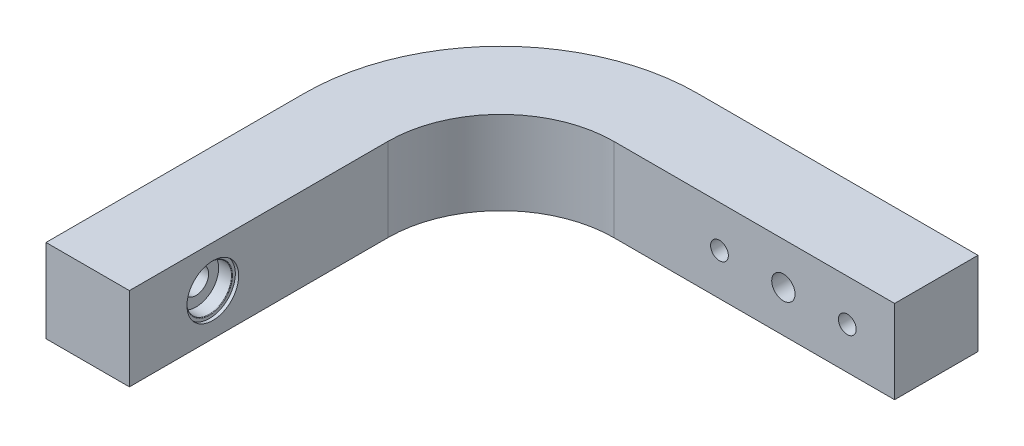
ISO-10303-21;
HEADER;
FILE_DESCRIPTION(('STEP AP214'),'2;1');
FILE_NAME('part.step','',(''),(''),'','','');
FILE_SCHEMA(('AUTOMOTIVE_DESIGN { 1 0 10303 214 1 1 1 1 }'));
ENDSEC;
DATA;
#1=APPLICATION_CONTEXT('core data for automotive mechanical design processes');
#2=APPLICATION_PROTOCOL_DEFINITION('international standard','automotive_design',2000,#1);
#3=PRODUCT_CONTEXT('',#1,'mechanical');
#4=PRODUCT('Part','Part','',(#3));
#5=PRODUCT_RELATED_PRODUCT_CATEGORY('part','',(#4));
#6=PRODUCT_DEFINITION_FORMATION('','',#4);
#7=PRODUCT_DEFINITION_CONTEXT('part definition',#1,'design');
#8=PRODUCT_DEFINITION('design','',#6,#7);
#9=PRODUCT_DEFINITION_SHAPE('','',#8);
#10=(LENGTH_UNIT() NAMED_UNIT(*) SI_UNIT(.MILLI.,.METRE.));
#11=(NAMED_UNIT(*) PLANE_ANGLE_UNIT() SI_UNIT($,.RADIAN.));
#12=(NAMED_UNIT(*) SI_UNIT($,.STERADIAN.) SOLID_ANGLE_UNIT());
#13=UNCERTAINTY_MEASURE_WITH_UNIT(LENGTH_MEASURE(1.E-05),#10,'distance_accuracy_value','');
#14=(GEOMETRIC_REPRESENTATION_CONTEXT(3) GLOBAL_UNCERTAINTY_ASSIGNED_CONTEXT((#13)) GLOBAL_UNIT_ASSIGNED_CONTEXT((#10,
#11,#12)) REPRESENTATION_CONTEXT('',''));
#15=CARTESIAN_POINT('',(0.,0.,0.));
#16=DIRECTION('',(0.,0.,1.));
#17=DIRECTION('',(1.,0.,0.));
#18=AXIS2_PLACEMENT_3D('',#15,#16,#17);
#19=CARTESIAN_POINT('',(-30.482748876,-7.5,35.321832584));
#20=DIRECTION('',(0.,1.,0.));
#21=DIRECTION('',(0.,0.,1.));
#22=AXIS2_PLACEMENT_3D('',#19,#20,#21);
#23=CYLINDRICAL_SURFACE('',#22,35.321832584);
#24=DIRECTION('',(0.,1.,0.));
#25=VECTOR('',#24,1.);
#26=CARTESIAN_POINT('',(-65.80458146,-7.5,35.321832584));
#27=LINE('',#26,#25);
#28=CARTESIAN_POINT('',(-65.80458146,-7.5,35.321832584));
#29=VERTEX_POINT('',#28);
#30=CARTESIAN_POINT('',(-65.80458146,7.5,35.321832584));
#31=VERTEX_POINT('',#30);
#32=EDGE_CURVE('E100',#29,#31,#27,.T.);
#33=ORIENTED_EDGE('',*,*,#32,.T.);
#34=CARTESIAN_POINT('',(-30.482748876,7.5,35.321832584));
#35=DIRECTION('',(0.,1.,0.));
#36=DIRECTION('',(0.,0.,1.));
#37=AXIS2_PLACEMENT_3D('',#34,#35,#36);
#38=CIRCLE('',#37,35.321832584);
#39=CARTESIAN_POINT('',(-30.482748876,7.5,0.));
#40=VERTEX_POINT('',#39);
#41=EDGE_CURVE('E103',#40,#31,#38,.T.);
#42=ORIENTED_EDGE('',*,*,#41,.F.);
#43=DIRECTION('',(0.,1.,0.));
#44=VECTOR('',#43,1.);
#45=CARTESIAN_POINT('',(-30.482748876,-7.5,0.));
#46=LINE('',#45,#44);
#47=CARTESIAN_POINT('',(-30.482748876,-7.5,0.));
#48=VERTEX_POINT('',#47);
#49=EDGE_CURVE('E11',#48,#40,#46,.T.);
#50=ORIENTED_EDGE('',*,*,#49,.F.);
#51=CARTESIAN_POINT('',(-30.482748876,-7.5,35.321832584));
#52=DIRECTION('',(0.,1.,0.));
#53=DIRECTION('',(0.,0.,1.));
#54=AXIS2_PLACEMENT_3D('',#51,#52,#53);
#55=CIRCLE('',#54,35.321832584);
#56=EDGE_CURVE('E104',#48,#29,#55,.T.);
#57=ORIENTED_EDGE('',*,*,#56,.T.);
#58=EDGE_LOOP('',(#33,#42,#50,#57));
#59=FACE_BOUND('',#58,.T.);
#60=ADVANCED_FACE('F38',(#59),#23,.T.);
#61=CARTESIAN_POINT('',(-30.482748876,-7.5,0.));
#62=DIRECTION('',(0.,0.,-1.));
#63=DIRECTION('',(-1.,0.,0.));
#64=AXIS2_PLACEMENT_3D('',#61,#62,#63);
#65=PLANE('',#64);
#66=CARTESIAN_POINT('',(11.5,0.,0.));
#67=DIRECTION('',(0.,0.,-1.));
#68=DIRECTION('',(-1.,0.,0.));
#69=AXIS2_PLACEMENT_3D('',#66,#67,#68);
#70=CIRCLE('',#69,1.6);
#71=CARTESIAN_POINT('',(9.9,0.,0.));
#72=VERTEX_POINT('',#71);
#73=EDGE_CURVE('E183',#72,#72,#70,.T.);
#74=ORIENTED_EDGE('',*,*,#73,.F.);
#75=EDGE_LOOP('',(#74));
#76=FACE_BOUND('',#75,.T.);
#77=CARTESIAN_POINT('',(-11.5,0.,0.));
#78=DIRECTION('',(0.,0.,-1.));
#79=DIRECTION('',(-1.,0.,0.));
#80=AXIS2_PLACEMENT_3D('',#77,#78,#79);
#81=CIRCLE('',#80,1.6);
#82=CARTESIAN_POINT('',(-13.1,0.,0.));
#83=VERTEX_POINT('',#82);
#84=EDGE_CURVE('E210',#83,#83,#81,.T.);
#85=ORIENTED_EDGE('',*,*,#84,.F.);
#86=EDGE_LOOP('',(#85));
#87=FACE_BOUND('',#86,.T.);
#88=CARTESIAN_POINT('',(0.,0.,0.));
#89=DIRECTION('',(0.,0.,-1.));
#90=DIRECTION('',(-1.,0.,0.));
#91=AXIS2_PLACEMENT_3D('',#88,#89,#90);
#92=CIRCLE('',#91,2.1);
#93=CARTESIAN_POINT('',(-2.1,0.,0.));
#94=VERTEX_POINT('',#93);
#95=EDGE_CURVE('E129',#94,#94,#92,.T.);
#96=ORIENTED_EDGE('',*,*,#95,.F.);
#97=EDGE_LOOP('',(#96));
#98=FACE_BOUND('',#97,.T.);
#99=ORIENTED_EDGE('',*,*,#49,.T.);
#100=DIRECTION('',(-1.,0.,0.));
#101=VECTOR('',#100,1.);
#102=CARTESIAN_POINT('',(-30.482748876,7.5,0.));
#103=LINE('',#102,#101);
#104=CARTESIAN_POINT('',(20.,7.5,0.));
#105=VERTEX_POINT('',#104);
#106=EDGE_CURVE('E122',#105,#40,#103,.T.);
#107=ORIENTED_EDGE('',*,*,#106,.F.);
#108=DIRECTION('',(0.,1.,0.));
#109=VECTOR('',#108,1.);
#110=CARTESIAN_POINT('',(20.,-7.5,0.));
#111=LINE('',#110,#109);
#112=CARTESIAN_POINT('',(20.,-7.5,0.));
#113=VERTEX_POINT('',#112);
#114=EDGE_CURVE('E46',#113,#105,#111,.T.);
#115=ORIENTED_EDGE('',*,*,#114,.F.);
#116=DIRECTION('',(-1.,0.,0.));
#117=VECTOR('',#116,1.);
#118=CARTESIAN_POINT('',(-30.482748876,-7.5,0.));
#119=LINE('',#118,#117);
#120=EDGE_CURVE('E109',#113,#48,#119,.T.);
#121=ORIENTED_EDGE('',*,*,#120,.T.);
#122=EDGE_LOOP('',(#99,#107,#115,#121));
#123=FACE_BOUND('',#122,.T.);
#124=ADVANCED_FACE('F217',(#76,#87,#98,#123),#65,.T.);
#125=CARTESIAN_POINT('',(20.,-7.5,15.));
#126=DIRECTION('',(1.,0.,0.));
#127=DIRECTION('',(0.,0.,-1.));
#128=AXIS2_PLACEMENT_3D('',#125,#126,#127);
#129=PLANE('',#128);
#130=ORIENTED_EDGE('',*,*,#114,.T.);
#131=DIRECTION('',(0.,0.,-1.));
#132=VECTOR('',#131,1.);
#133=CARTESIAN_POINT('',(20.,7.5,15.));
#134=LINE('',#133,#132);
#135=CARTESIAN_POINT('',(20.,7.5,15.));
#136=VERTEX_POINT('',#135);
#137=EDGE_CURVE('E142',#136,#105,#134,.T.);
#138=ORIENTED_EDGE('',*,*,#137,.F.);
#139=DIRECTION('',(0.,1.,0.));
#140=VECTOR('',#139,1.);
#141=CARTESIAN_POINT('',(20.,-7.5,15.));
#142=LINE('',#141,#140);
#143=CARTESIAN_POINT('',(20.,-7.5,15.));
#144=VERTEX_POINT('',#143);
#145=EDGE_CURVE('E164',#144,#136,#142,.T.);
#146=ORIENTED_EDGE('',*,*,#145,.F.);
#147=DIRECTION('',(0.,0.,-1.));
#148=VECTOR('',#147,1.);
#149=CARTESIAN_POINT('',(20.,-7.5,15.));
#150=LINE('',#149,#148);
#151=EDGE_CURVE('E160',#144,#113,#150,.T.);
#152=ORIENTED_EDGE('',*,*,#151,.T.);
#153=EDGE_LOOP('',(#130,#138,#146,#152));
#154=FACE_BOUND('',#153,.T.);
#155=ADVANCED_FACE('F220',(#154),#129,.T.);
#156=CARTESIAN_POINT('',(-30.482748876,-7.5,15.));
#157=DIRECTION('',(0.,0.,1.));
#158=DIRECTION('',(1.,0.,0.));
#159=AXIS2_PLACEMENT_3D('',#156,#157,#158);
#160=PLANE('',#159);
#161=CARTESIAN_POINT('',(11.5,0.,15.));
#162=DIRECTION('',(0.,0.,1.));
#163=DIRECTION('',(1.,0.,0.));
#164=AXIS2_PLACEMENT_3D('',#161,#162,#163);
#165=CIRCLE('',#164,1.6);
#166=CARTESIAN_POINT('',(13.1,0.,15.));
#167=VERTEX_POINT('',#166);
#168=EDGE_CURVE('E123',#167,#167,#165,.T.);
#169=ORIENTED_EDGE('',*,*,#168,.F.);
#170=EDGE_LOOP('',(#169));
#171=FACE_BOUND('',#170,.T.);
#172=CARTESIAN_POINT('',(-11.5,0.,15.));
#173=DIRECTION('',(0.,0.,1.));
#174=DIRECTION('',(1.,0.,0.));
#175=AXIS2_PLACEMENT_3D('',#172,#173,#174);
#176=CIRCLE('',#175,1.6);
#177=CARTESIAN_POINT('',(-9.9,0.,15.));
#178=VERTEX_POINT('',#177);
#179=EDGE_CURVE('E126',#178,#178,#176,.T.);
#180=ORIENTED_EDGE('',*,*,#179,.F.);
#181=EDGE_LOOP('',(#180));
#182=FACE_BOUND('',#181,.T.);
#183=CARTESIAN_POINT('',(0.,0.,15.));
#184=DIRECTION('',(0.,0.,1.));
#185=DIRECTION('',(1.,0.,0.));
#186=AXIS2_PLACEMENT_3D('',#183,#184,#185);
#187=CIRCLE('',#186,2.1);
#188=CARTESIAN_POINT('',(2.1,0.,15.));
#189=VERTEX_POINT('',#188);
#190=EDGE_CURVE('E173',#189,#189,#187,.T.);
#191=ORIENTED_EDGE('',*,*,#190,.F.);
#192=EDGE_LOOP('',(#191));
#193=FACE_BOUND('',#192,.T.);
#194=ORIENTED_EDGE('',*,*,#145,.T.);
#195=DIRECTION('',(1.,0.,0.));
#196=VECTOR('',#195,1.);
#197=CARTESIAN_POINT('',(-30.482748876,7.5,15.));
#198=LINE('',#197,#196);
#199=CARTESIAN_POINT('',(-30.482748876,7.5,15.));
#200=VERTEX_POINT('',#199);
#201=EDGE_CURVE('E139',#200,#136,#198,.T.);
#202=ORIENTED_EDGE('',*,*,#201,.F.);
#203=DIRECTION('',(0.,1.,0.));
#204=VECTOR('',#203,1.);
#205=CARTESIAN_POINT('',(-30.482748876,-7.5,15.));
#206=LINE('',#205,#204);
#207=CARTESIAN_POINT('',(-30.482748876,-7.5,15.));
#208=VERTEX_POINT('',#207);
#209=EDGE_CURVE('E166',#208,#200,#206,.T.);
#210=ORIENTED_EDGE('',*,*,#209,.F.);
#211=DIRECTION('',(1.,0.,0.));
#212=VECTOR('',#211,1.);
#213=CARTESIAN_POINT('',(-30.482748876,-7.5,15.));
#214=LINE('',#213,#212);
#215=EDGE_CURVE('E157',#208,#144,#214,.T.);
#216=ORIENTED_EDGE('',*,*,#215,.T.);
#217=EDGE_LOOP('',(#194,#202,#210,#216));
#218=FACE_BOUND('',#217,.T.);
#219=ADVANCED_FACE('F243',(#171,#182,#193,#218),#160,.T.);
#220=CARTESIAN_POINT('',(-30.482748876,-7.5,35.321832584));
#221=DIRECTION('',(0.,1.,0.));
#222=DIRECTION('',(0.,0.,1.));
#223=AXIS2_PLACEMENT_3D('',#220,#221,#222);
#224=CYLINDRICAL_SURFACE('',#223,20.321832584);
#225=ORIENTED_EDGE('',*,*,#209,.T.);
#226=CARTESIAN_POINT('',(-30.482748876,7.5,35.321832584));
#227=DIRECTION('',(0.,-1.,0.));
#228=DIRECTION('',(0.,0.,-1.));
#229=AXIS2_PLACEMENT_3D('',#226,#227,#228);
#230=CIRCLE('',#229,20.321832584);
#231=CARTESIAN_POINT('',(-50.80458146,7.5,35.321832584));
#232=VERTEX_POINT('',#231);
#233=EDGE_CURVE('E136',#232,#200,#230,.T.);
#234=ORIENTED_EDGE('',*,*,#233,.F.);
#235=DIRECTION('',(0.,1.,0.));
#236=VECTOR('',#235,1.);
#237=CARTESIAN_POINT('',(-50.80458146,-7.5,35.321832584));
#238=LINE('',#237,#236);
#239=CARTESIAN_POINT('',(-50.80458146,-7.5,35.321832584));
#240=VERTEX_POINT('',#239);
#241=EDGE_CURVE('E168',#240,#232,#238,.T.);
#242=ORIENTED_EDGE('',*,*,#241,.F.);
#243=CARTESIAN_POINT('',(-30.482748876,-7.5,35.321832584));
#244=DIRECTION('',(0.,-1.,0.));
#245=DIRECTION('',(0.,0.,-1.));
#246=AXIS2_PLACEMENT_3D('',#243,#244,#245);
#247=CIRCLE('',#246,20.321832584);
#248=EDGE_CURVE('E154',#240,#208,#247,.T.);
#249=ORIENTED_EDGE('',*,*,#248,.T.);
#250=EDGE_LOOP('',(#225,#234,#242,#249));
#251=FACE_BOUND('',#250,.T.);
#252=ADVANCED_FACE('F241',(#251),#224,.F.);
#253=CARTESIAN_POINT('',(-50.80458146,-7.5,81.80458146));
#254=DIRECTION('',(1.,0.,0.));
#255=DIRECTION('',(0.,0.,-1.));
#256=AXIS2_PLACEMENT_3D('',#253,#254,#255);
#257=PLANE('',#256);
#258=CARTESIAN_POINT('',(-50.80458146,0.,66.80458146));
#259=DIRECTION('',(-1.,0.,0.));
#260=DIRECTION('',(0.,0.,1.));
#261=AXIS2_PLACEMENT_3D('',#258,#259,#260);
#262=CIRCLE('',#261,4.65000000000002);
#263=CARTESIAN_POINT('',(-50.80458146,0.,71.45458146));
#264=VERTEX_POINT('',#263);
#265=EDGE_CURVE('E206',#264,#264,#262,.T.);
#266=ORIENTED_EDGE('',*,*,#265,.T.);
#267=EDGE_LOOP('',(#266));
#268=FACE_BOUND('',#267,.T.);
#269=ORIENTED_EDGE('',*,*,#241,.T.);
#270=DIRECTION('',(0.,0.,-1.));
#271=VECTOR('',#270,1.);
#272=CARTESIAN_POINT('',(-50.80458146,7.5,81.80458146));
#273=LINE('',#272,#271);
#274=CARTESIAN_POINT('',(-50.80458146,7.5,81.80458146));
#275=VERTEX_POINT('',#274);
#276=EDGE_CURVE('E133',#275,#232,#273,.T.);
#277=ORIENTED_EDGE('',*,*,#276,.F.);
#278=DIRECTION('',(0.,1.,0.));
#279=VECTOR('',#278,1.);
#280=CARTESIAN_POINT('',(-50.80458146,-7.5,81.80458146));
#281=LINE('',#280,#279);
#282=CARTESIAN_POINT('',(-50.80458146,-7.5,81.80458146));
#283=VERTEX_POINT('',#282);
#284=EDGE_CURVE('E170',#283,#275,#281,.T.);
#285=ORIENTED_EDGE('',*,*,#284,.F.);
#286=DIRECTION('',(0.,0.,-1.));
#287=VECTOR('',#286,1.);
#288=CARTESIAN_POINT('',(-50.80458146,-7.5,81.80458146));
#289=LINE('',#288,#287);
#290=EDGE_CURVE('E151',#283,#240,#289,.T.);
#291=ORIENTED_EDGE('',*,*,#290,.T.);
#292=EDGE_LOOP('',(#269,#277,#285,#291));
#293=FACE_BOUND('',#292,.T.);
#294=ADVANCED_FACE('F239',(#268,#293),#257,.T.);
#295=CARTESIAN_POINT('',(-65.80458146,-7.5,81.80458146));
#296=DIRECTION('',(0.,0.,1.));
#297=DIRECTION('',(1.,0.,0.));
#298=AXIS2_PLACEMENT_3D('',#295,#296,#297);
#299=PLANE('',#298);
#300=ORIENTED_EDGE('',*,*,#284,.T.);
#301=DIRECTION('',(1.,0.,0.));
#302=VECTOR('',#301,1.);
#303=CARTESIAN_POINT('',(-65.80458146,7.5,81.80458146));
#304=LINE('',#303,#302);
#305=CARTESIAN_POINT('',(-65.80458146,7.5,81.80458146));
#306=VERTEX_POINT('',#305);
#307=EDGE_CURVE('E117',#306,#275,#304,.T.);
#308=ORIENTED_EDGE('',*,*,#307,.F.);
#309=DIRECTION('',(0.,1.,0.));
#310=VECTOR('',#309,1.);
#311=CARTESIAN_POINT('',(-65.80458146,-7.5,81.80458146));
#312=LINE('',#311,#310);
#313=CARTESIAN_POINT('',(-65.80458146,-7.5,81.80458146));
#314=VERTEX_POINT('',#313);
#315=EDGE_CURVE('E108',#314,#306,#312,.T.);
#316=ORIENTED_EDGE('',*,*,#315,.F.);
#317=DIRECTION('',(1.,0.,0.));
#318=VECTOR('',#317,1.);
#319=CARTESIAN_POINT('',(-65.80458146,-7.5,81.80458146));
#320=LINE('',#319,#318);
#321=EDGE_CURVE('E148',#314,#283,#320,.T.);
#322=ORIENTED_EDGE('',*,*,#321,.T.);
#323=EDGE_LOOP('',(#300,#308,#316,#322));
#324=FACE_BOUND('',#323,.T.);
#325=ADVANCED_FACE('F235',(#324),#299,.T.);
#326=CARTESIAN_POINT('',(-65.80458146,-7.5,35.321832584));
#327=DIRECTION('',(-1.,0.,0.));
#328=DIRECTION('',(0.,0.,1.));
#329=AXIS2_PLACEMENT_3D('',#326,#327,#328);
#330=PLANE('',#329);
#331=CARTESIAN_POINT('',(-65.80458146,0.,66.80458146));
#332=DIRECTION('',(-1.,0.,0.));
#333=DIRECTION('',(0.,0.,1.));
#334=AXIS2_PLACEMENT_3D('',#331,#332,#333);
#335=CIRCLE('',#334,4.65000000000002);
#336=CARTESIAN_POINT('',(-65.80458146,0.,71.45458146));
#337=VERTEX_POINT('',#336);
#338=EDGE_CURVE('E179',#337,#337,#335,.T.);
#339=ORIENTED_EDGE('',*,*,#338,.F.);
#340=EDGE_LOOP('',(#339));
#341=FACE_BOUND('',#340,.T.);
#342=ORIENTED_EDGE('',*,*,#315,.T.);
#343=DIRECTION('',(0.,0.,1.));
#344=VECTOR('',#343,1.);
#345=CARTESIAN_POINT('',(-65.80458146,7.5,35.321832584));
#346=LINE('',#345,#344);
#347=EDGE_CURVE('E112',#31,#306,#346,.T.);
#348=ORIENTED_EDGE('',*,*,#347,.F.);
#349=ORIENTED_EDGE('',*,*,#32,.F.);
#350=DIRECTION('',(0.,0.,1.));
#351=VECTOR('',#350,1.);
#352=CARTESIAN_POINT('',(-65.80458146,-7.5,35.321832584));
#353=LINE('',#352,#351);
#354=EDGE_CURVE('E146',#29,#314,#353,.T.);
#355=ORIENTED_EDGE('',*,*,#354,.T.);
#356=EDGE_LOOP('',(#342,#348,#349,#355));
#357=FACE_BOUND('',#356,.T.);
#358=ADVANCED_FACE('F113',(#341,#357),#330,.T.);
#359=CARTESIAN_POINT('',(-30.482748876,-7.5,35.321832584));
#360=DIRECTION('',(0.,1.,0.));
#361=DIRECTION('',(0.,0.,1.));
#362=AXIS2_PLACEMENT_3D('',#359,#360,#361);
#363=PLANE('',#362);
#364=ORIENTED_EDGE('',*,*,#56,.F.);
#365=ORIENTED_EDGE('',*,*,#120,.F.);
#366=ORIENTED_EDGE('',*,*,#151,.F.);
#367=ORIENTED_EDGE('',*,*,#215,.F.);
#368=ORIENTED_EDGE('',*,*,#248,.F.);
#369=ORIENTED_EDGE('',*,*,#290,.F.);
#370=ORIENTED_EDGE('',*,*,#321,.F.);
#371=ORIENTED_EDGE('',*,*,#354,.F.);
#372=EDGE_LOOP('',(#364,#365,#366,#367,#368,#369,#370,#371));
#373=FACE_BOUND('',#372,.T.);
#374=ADVANCED_FACE('F229',(#373),#363,.F.);
#375=CARTESIAN_POINT('',(-30.482748876,7.5,35.321832584));
#376=DIRECTION('',(0.,1.,0.));
#377=DIRECTION('',(0.,0.,1.));
#378=AXIS2_PLACEMENT_3D('',#375,#376,#377);
#379=PLANE('',#378);
#380=ORIENTED_EDGE('',*,*,#41,.T.);
#381=ORIENTED_EDGE('',*,*,#347,.T.);
#382=ORIENTED_EDGE('',*,*,#307,.T.);
#383=ORIENTED_EDGE('',*,*,#276,.T.);
#384=ORIENTED_EDGE('',*,*,#233,.T.);
#385=ORIENTED_EDGE('',*,*,#201,.T.);
#386=ORIENTED_EDGE('',*,*,#137,.T.);
#387=ORIENTED_EDGE('',*,*,#106,.T.);
#388=EDGE_LOOP('',(#380,#381,#382,#383,#384,#385,#386,#387));
#389=FACE_BOUND('',#388,.T.);
#390=ADVANCED_FACE('F120',(#389),#379,.T.);
#391=CARTESIAN_POINT('',(0.,0.,81.80458146));
#392=DIRECTION('',(0.,0.,-1.));
#393=DIRECTION('',(-1.,0.,0.));
#394=AXIS2_PLACEMENT_3D('',#391,#392,#393);
#395=CYLINDRICAL_SURFACE('',#394,2.1);
#396=ORIENTED_EDGE('',*,*,#190,.T.);
#397=EDGE_LOOP('',(#396));
#398=FACE_BOUND('',#397,.T.);
#399=ORIENTED_EDGE('',*,*,#95,.T.);
#400=EDGE_LOOP('',(#399));
#401=FACE_BOUND('',#400,.T.);
#402=ADVANCED_FACE('F327',(#398,#401),#395,.F.);
#403=CARTESIAN_POINT('',(-11.5,0.,81.80458146));
#404=DIRECTION('',(0.,0.,-1.));
#405=DIRECTION('',(-1.,0.,0.));
#406=AXIS2_PLACEMENT_3D('',#403,#404,#405);
#407=CYLINDRICAL_SURFACE('',#406,1.6);
#408=ORIENTED_EDGE('',*,*,#179,.T.);
#409=EDGE_LOOP('',(#408));
#410=FACE_BOUND('',#409,.T.);
#411=ORIENTED_EDGE('',*,*,#84,.T.);
#412=EDGE_LOOP('',(#411));
#413=FACE_BOUND('',#412,.T.);
#414=ADVANCED_FACE('F347',(#410,#413),#407,.F.);
#415=CARTESIAN_POINT('',(11.5,0.,81.80458146));
#416=DIRECTION('',(0.,0.,-1.));
#417=DIRECTION('',(-1.,0.,0.));
#418=AXIS2_PLACEMENT_3D('',#415,#416,#417);
#419=CYLINDRICAL_SURFACE('',#418,1.6);
#420=ORIENTED_EDGE('',*,*,#168,.T.);
#421=EDGE_LOOP('',(#420));
#422=FACE_BOUND('',#421,.T.);
#423=ORIENTED_EDGE('',*,*,#73,.T.);
#424=EDGE_LOOP('',(#423));
#425=FACE_BOUND('',#424,.T.);
#426=ADVANCED_FACE('F215',(#422,#425),#419,.F.);
#427=CARTESIAN_POINT('',(-53.80458146,0.,70.85458146));
#428=DIRECTION('',(-1.,0.,0.));
#429=DIRECTION('',(0.,0.,1.));
#430=AXIS2_PLACEMENT_3D('',#427,#428,#429);
#431=PLANE('',#430);
#432=CARTESIAN_POINT('',(-53.80458146,0.,66.80458146));
#433=DIRECTION('',(-1.,0.,0.));
#434=DIRECTION('',(0.,0.,1.));
#435=AXIS2_PLACEMENT_3D('',#432,#433,#434);
#436=CIRCLE('',#435,4.05);
#437=CARTESIAN_POINT('',(-53.80458146,0.,70.85458146));
#438=VERTEX_POINT('',#437);
#439=EDGE_CURVE('E194',#438,#438,#436,.T.);
#440=ORIENTED_EDGE('',*,*,#439,.F.);
#441=EDGE_LOOP('',(#440));
#442=FACE_BOUND('',#441,.T.);
#443=CARTESIAN_POINT('',(-53.80458146,0.,66.80458146));
#444=DIRECTION('',(-1.,0.,0.));
#445=DIRECTION('',(0.,0.,1.));
#446=AXIS2_PLACEMENT_3D('',#443,#444,#445);
#447=CIRCLE('',#446,2.25);
#448=CARTESIAN_POINT('',(-53.80458146,0.,69.05458146));
#449=VERTEX_POINT('',#448);
#450=EDGE_CURVE('E177',#449,#449,#447,.F.);
#451=ORIENTED_EDGE('',*,*,#450,.F.);
#452=EDGE_LOOP('',(#451));
#453=FACE_BOUND('',#452,.T.);
#454=ADVANCED_FACE('F365',(#442,#453),#431,.F.);
#455=CARTESIAN_POINT('',(-84.3923413330759,0.,66.80458146));
#456=DIRECTION('',(-1.,0.,0.));
#457=DIRECTION('',(0.,0.,1.));
#458=AXIS2_PLACEMENT_3D('',#455,#456,#457);
#459=CYLINDRICAL_SURFACE('',#458,4.65000000000002);
#460=ORIENTED_EDGE('',*,*,#265,.F.);
#461=EDGE_LOOP('',(#460));
#462=FACE_BOUND('',#461,.T.);
#463=CARTESIAN_POINT('',(-51.40458146,0.,66.80458146));
#464=DIRECTION('',(-1.,0.,0.));
#465=DIRECTION('',(0.,0.,1.));
#466=AXIS2_PLACEMENT_3D('',#463,#464,#465);
#467=CIRCLE('',#466,4.65000000000002);
#468=CARTESIAN_POINT('',(-51.40458146,0.,71.45458146));
#469=VERTEX_POINT('',#468);
#470=EDGE_CURVE('E203',#469,#469,#467,.T.);
#471=ORIENTED_EDGE('',*,*,#470,.T.);
#472=EDGE_LOOP('',(#471));
#473=FACE_BOUND('',#472,.T.);
#474=ADVANCED_FACE('F374',(#462,#473),#459,.F.);
#475=CARTESIAN_POINT('',(-51.40458146,0.,71.45458146));
#476=DIRECTION('',(-1.,0.,0.));
#477=DIRECTION('',(0.,0.,1.));
#478=AXIS2_PLACEMENT_3D('',#475,#476,#477);
#479=PLANE('',#478);
#480=ORIENTED_EDGE('',*,*,#470,.F.);
#481=EDGE_LOOP('',(#480));
#482=FACE_BOUND('',#481,.T.);
#483=CARTESIAN_POINT('',(-51.40458146,0.,66.80458146));
#484=DIRECTION('',(-1.,0.,0.));
#485=DIRECTION('',(0.,0.,1.));
#486=AXIS2_PLACEMENT_3D('',#483,#484,#485);
#487=CIRCLE('',#486,4.15);
#488=CARTESIAN_POINT('',(-51.40458146,0.,70.95458146));
#489=VERTEX_POINT('',#488);
#490=EDGE_CURVE('E200',#489,#489,#487,.T.);
#491=ORIENTED_EDGE('',*,*,#490,.T.);
#492=EDGE_LOOP('',(#491));
#493=FACE_BOUND('',#492,.T.);
#494=ADVANCED_FACE('F384',(#482,#493),#479,.F.);
#495=CARTESIAN_POINT('',(-51.50458146,0.,66.80458146));
#496=DIRECTION('',(-1.,0.,0.));
#497=DIRECTION('',(0.,0.,1.));
#498=AXIS2_PLACEMENT_3D('',#495,#496,#497);
#499=TOROIDAL_SURFACE('',#498,4.15,0.100000000000003);
#500=ORIENTED_EDGE('',*,*,#490,.F.);
#501=EDGE_LOOP('',(#500));
#502=FACE_BOUND('',#501,.T.);
#503=CARTESIAN_POINT('',(-51.50458146,0.,66.80458146));
#504=DIRECTION('',(-1.,0.,0.));
#505=DIRECTION('',(0.,0.,1.));
#506=AXIS2_PLACEMENT_3D('',#503,#504,#505);
#507=CIRCLE('',#506,4.05);
#508=CARTESIAN_POINT('',(-51.50458146,0.,70.85458146));
#509=VERTEX_POINT('',#508);
#510=EDGE_CURVE('E197',#509,#509,#507,.T.);
#511=ORIENTED_EDGE('',*,*,#510,.T.);
#512=EDGE_LOOP('',(#511));
#513=FACE_BOUND('',#512,.T.);
#514=ADVANCED_FACE('F394',(#502,#513),#499,.T.);
#515=CARTESIAN_POINT('',(-84.3923413330759,0.,66.80458146));
#516=DIRECTION('',(-1.,0.,0.));
#517=DIRECTION('',(0.,0.,1.));
#518=AXIS2_PLACEMENT_3D('',#515,#516,#517);
#519=CYLINDRICAL_SURFACE('',#518,4.05);
#520=ORIENTED_EDGE('',*,*,#510,.F.);
#521=EDGE_LOOP('',(#520));
#522=FACE_BOUND('',#521,.T.);
#523=ORIENTED_EDGE('',*,*,#439,.T.);
#524=EDGE_LOOP('',(#523));
#525=FACE_BOUND('',#524,.T.);
#526=ADVANCED_FACE('F404',(#522,#525),#519,.F.);
#527=CARTESIAN_POINT('',(-62.80458146,0.,70.85458146));
#528=DIRECTION('',(1.,0.,0.));
#529=DIRECTION('',(0.,0.,-1.));
#530=AXIS2_PLACEMENT_3D('',#527,#528,#529);
#531=PLANE('',#530);
#532=CARTESIAN_POINT('',(-62.80458146,0.,66.80458146));
#533=DIRECTION('',(-1.,0.,0.));
#534=DIRECTION('',(0.,0.,1.));
#535=AXIS2_PLACEMENT_3D('',#532,#533,#534);
#536=CIRCLE('',#535,4.05);
#537=CARTESIAN_POINT('',(-62.80458146,0.,70.85458146));
#538=VERTEX_POINT('',#537);
#539=EDGE_CURVE('E209',#538,#538,#536,.T.);
#540=ORIENTED_EDGE('',*,*,#539,.T.);
#541=EDGE_LOOP('',(#540));
#542=FACE_BOUND('',#541,.T.);
#543=CARTESIAN_POINT('',(-62.80458146,0.,66.80458146));
#544=DIRECTION('',(1.,0.,0.));
#545=DIRECTION('',(0.,0.,-1.));
#546=AXIS2_PLACEMENT_3D('',#543,#544,#545);
#547=CIRCLE('',#546,2.25);
#548=CARTESIAN_POINT('',(-62.80458146,0.,64.55458146));
#549=VERTEX_POINT('',#548);
#550=EDGE_CURVE('E41',#549,#549,#547,.F.);
#551=ORIENTED_EDGE('',*,*,#550,.F.);
#552=EDGE_LOOP('',(#551));
#553=FACE_BOUND('',#552,.T.);
#554=ADVANCED_FACE('F414',(#542,#553),#531,.F.);
#555=CARTESIAN_POINT('',(-84.3923413330759,0.,66.80458146));
#556=DIRECTION('',(-1.,0.,0.));
#557=DIRECTION('',(0.,0.,1.));
#558=AXIS2_PLACEMENT_3D('',#555,#556,#557);
#559=CYLINDRICAL_SURFACE('',#558,4.65000000000002);
#560=CARTESIAN_POINT('',(-65.20458146,0.,66.80458146));
#561=DIRECTION('',(-1.,0.,0.));
#562=DIRECTION('',(0.,0.,1.));
#563=AXIS2_PLACEMENT_3D('',#560,#561,#562);
#564=CIRCLE('',#563,4.65000000000002);
#565=CARTESIAN_POINT('',(-65.20458146,0.,71.45458146));
#566=VERTEX_POINT('',#565);
#567=EDGE_CURVE('E185',#566,#566,#564,.T.);
#568=ORIENTED_EDGE('',*,*,#567,.F.);
#569=EDGE_LOOP('',(#568));
#570=FACE_BOUND('',#569,.T.);
#571=ORIENTED_EDGE('',*,*,#338,.T.);
#572=EDGE_LOOP('',(#571));
#573=FACE_BOUND('',#572,.T.);
#574=ADVANCED_FACE('F424',(#570,#573),#559,.F.);
#575=CARTESIAN_POINT('',(-65.20458146,0.,71.45458146));
#576=DIRECTION('',(1.,0.,0.));
#577=DIRECTION('',(0.,0.,-1.));
#578=AXIS2_PLACEMENT_3D('',#575,#576,#577);
#579=PLANE('',#578);
#580=CARTESIAN_POINT('',(-65.20458146,0.,66.80458146));
#581=DIRECTION('',(-1.,0.,0.));
#582=DIRECTION('',(0.,0.,1.));
#583=AXIS2_PLACEMENT_3D('',#580,#581,#582);
#584=CIRCLE('',#583,4.15);
#585=CARTESIAN_POINT('',(-65.20458146,0.,70.95458146));
#586=VERTEX_POINT('',#585);
#587=EDGE_CURVE('E190',#586,#586,#584,.T.);
#588=ORIENTED_EDGE('',*,*,#587,.F.);
#589=EDGE_LOOP('',(#588));
#590=FACE_BOUND('',#589,.T.);
#591=ORIENTED_EDGE('',*,*,#567,.T.);
#592=EDGE_LOOP('',(#591));
#593=FACE_BOUND('',#592,.T.);
#594=ADVANCED_FACE('F434',(#590,#593),#579,.F.);
#595=CARTESIAN_POINT('',(-65.10458146,0.,66.80458146));
#596=DIRECTION('',(-1.,0.,0.));
#597=DIRECTION('',(0.,0.,1.));
#598=AXIS2_PLACEMENT_3D('',#595,#596,#597);
#599=TOROIDAL_SURFACE('',#598,4.15,0.100000000000003);
#600=CARTESIAN_POINT('',(-65.10458146,0.,66.80458146));
#601=DIRECTION('',(-1.,0.,0.));
#602=DIRECTION('',(0.,0.,1.));
#603=AXIS2_PLACEMENT_3D('',#600,#601,#602);
#604=CIRCLE('',#603,4.05);
#605=CARTESIAN_POINT('',(-65.10458146,0.,70.85458146));
#606=VERTEX_POINT('',#605);
#607=EDGE_CURVE('E470',#606,#606,#604,.T.);
#608=ORIENTED_EDGE('',*,*,#607,.F.);
#609=EDGE_LOOP('',(#608));
#610=FACE_BOUND('',#609,.T.);
#611=ORIENTED_EDGE('',*,*,#587,.T.);
#612=EDGE_LOOP('',(#611));
#613=FACE_BOUND('',#612,.T.);
#614=ADVANCED_FACE('F444',(#610,#613),#599,.T.);
#615=CARTESIAN_POINT('',(-84.3923413330759,0.,66.80458146));
#616=DIRECTION('',(-1.,0.,0.));
#617=DIRECTION('',(0.,0.,1.));
#618=AXIS2_PLACEMENT_3D('',#615,#616,#617);
#619=CYLINDRICAL_SURFACE('',#618,4.05);
#620=ORIENTED_EDGE('',*,*,#539,.F.);
#621=EDGE_LOOP('',(#620));
#622=FACE_BOUND('',#621,.T.);
#623=ORIENTED_EDGE('',*,*,#607,.T.);
#624=EDGE_LOOP('',(#623));
#625=FACE_BOUND('',#624,.T.);
#626=ADVANCED_FACE('F337',(#622,#625),#619,.F.);
#627=CARTESIAN_POINT('',(20.,0.,66.80458146));
#628=DIRECTION('',(-1.,0.,0.));
#629=DIRECTION('',(0.,0.,1.));
#630=AXIS2_PLACEMENT_3D('',#627,#628,#629);
#631=CYLINDRICAL_SURFACE('',#630,2.25);
#632=ORIENTED_EDGE('',*,*,#550,.T.);
#633=EDGE_LOOP('',(#632));
#634=FACE_BOUND('',#633,.T.);
#635=ORIENTED_EDGE('',*,*,#450,.T.);
#636=EDGE_LOOP('',(#635));
#637=FACE_BOUND('',#636,.T.);
#638=ADVANCED_FACE('F332',(#634,#637),#631,.F.);
#639=CLOSED_SHELL('',(#60,#124,#155,#219,#252,#294,#325,#358,#374,#390,#402,#414,#426,#454,#474,
#494,#514,#526,#554,#574,#594,#614,#626,#638));
#640=MANIFOLD_SOLID_BREP('B2',#639);
#641=ADVANCED_BREP_SHAPE_REPRESENTATION('',(#18,#640),#14);
#642=SHAPE_DEFINITION_REPRESENTATION(#9,#641);
ENDSEC;
END-ISO-10303-21;
